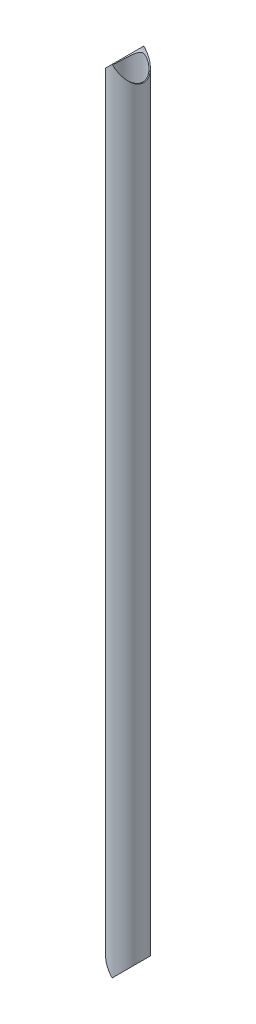
ISO-10303-21;
HEADER;
FILE_DESCRIPTION(('STEP AP214'),'2;1');
FILE_NAME('part.step','',(''),(''),'','','');
FILE_SCHEMA(('AUTOMOTIVE_DESIGN { 1 0 10303 214 1 1 1 1 }'));
ENDSEC;
DATA;
#1=APPLICATION_CONTEXT('core data for automotive mechanical design processes');
#2=APPLICATION_PROTOCOL_DEFINITION('international standard','automotive_design',2000,#1);
#3=PRODUCT_CONTEXT('',#1,'mechanical');
#4=PRODUCT('Part','Part','',(#3));
#5=PRODUCT_RELATED_PRODUCT_CATEGORY('part','',(#4));
#6=PRODUCT_DEFINITION_FORMATION('','',#4);
#7=PRODUCT_DEFINITION_CONTEXT('part definition',#1,'design');
#8=PRODUCT_DEFINITION('design','',#6,#7);
#9=PRODUCT_DEFINITION_SHAPE('','',#8);
#10=(LENGTH_UNIT() NAMED_UNIT(*) SI_UNIT(.MILLI.,.METRE.));
#11=(NAMED_UNIT(*) PLANE_ANGLE_UNIT() SI_UNIT($,.RADIAN.));
#12=(NAMED_UNIT(*) SI_UNIT($,.STERADIAN.) SOLID_ANGLE_UNIT());
#13=UNCERTAINTY_MEASURE_WITH_UNIT(LENGTH_MEASURE(1.E-05),#10,'distance_accuracy_value','');
#14=(GEOMETRIC_REPRESENTATION_CONTEXT(3) GLOBAL_UNCERTAINTY_ASSIGNED_CONTEXT((#13)) GLOBAL_UNIT_ASSIGNED_CONTEXT((#10,
#11,#12)) REPRESENTATION_CONTEXT('',''));
#15=CARTESIAN_POINT('',(0.,0.,0.));
#16=DIRECTION('',(0.,0.,1.));
#17=DIRECTION('',(1.,0.,0.));
#18=AXIS2_PLACEMENT_3D('',#15,#16,#17);
#19=CARTESIAN_POINT('',(0.,1586.5,0.));
#20=DIRECTION('',(0.,-1.,0.));
#21=DIRECTION('',(0.,0.,-1.));
#22=AXIS2_PLACEMENT_3D('',#19,#20,#21);
#23=CYLINDRICAL_SURFACE('',#22,29.75);
#24=CARTESIAN_POINT('',(0.,11.0905365064094,-29.75));
#25=CARTESIAN_POINT('',(-0.389786634074738,11.0905547654798,-29.7499958686815));
#26=CARTESIAN_POINT('',(-0.779656350245633,11.1112426258922,-29.7423062049833));
#27=CARTESIAN_POINT('',(-1.55465548150594,11.1923223687949,-29.7118861487787));
#28=CARTESIAN_POINT('',(-1.93978301720583,11.252729507378,-29.6891499769177));
#29=CARTESIAN_POINT('',(-2.70325860852338,11.4090848817424,-29.6294151445385));
#30=CARTESIAN_POINT('',(-3.08156917377103,11.5051890326873,-29.5923538865364));
#31=CARTESIAN_POINT('',(-3.8279231720212,11.7271393973298,-29.5050988141755));
#32=CARTESIAN_POINT('',(-4.19595982300085,11.8530047611088,-29.4548965418945));
#33=CARTESIAN_POINT('',(-4.83988887146421,12.0977982566289,-29.3550528177869));
#34=CARTESIAN_POINT('',(-5.11798813096088,12.2119874754248,-29.3077946821765));
#35=CARTESIAN_POINT('',(-5.66755818667232,12.4523189071293,-29.2064940913103));
#36=CARTESIAN_POINT('',(-5.93903125899485,12.578456940805,-29.1524540059855));
#37=CARTESIAN_POINT('',(-6.74454617771096,12.9718358118248,-28.9806059411968));
#38=CARTESIAN_POINT('',(-7.26931051096886,13.2538934019326,-28.8531291573911));
#39=CARTESIAN_POINT('',(-8.29858681774595,13.8451735068167,-28.5741341889987));
#40=CARTESIAN_POINT('',(-8.80302998445809,14.154478582079,-28.4225417313817));
#41=CARTESIAN_POINT('',(-9.79302702885514,14.7905267964488,-28.0968059614199));
#42=CARTESIAN_POINT('',(-10.2785852095513,15.1172659224224,-27.9226678257989));
#43=CARTESIAN_POINT('',(-11.2265971119138,15.7772779148017,-27.5550501032298));
#44=CARTESIAN_POINT('',(-11.6892796553624,16.1103943924101,-27.361876778719));
#45=CARTESIAN_POINT('',(-12.6004263626293,16.7832192509268,-26.9544207903546));
#46=CARTESIAN_POINT('',(-13.0488883889044,17.1229286105824,-26.7401349726928));
#47=CARTESIAN_POINT('',(-13.9329080362446,17.8058179800166,-26.2903530672039));
#48=CARTESIAN_POINT('',(-14.3684562690527,18.1490002827225,-26.0548420280147));
#49=CARTESIAN_POINT('',(-15.2269023152952,18.835932456591,-25.5626428997468));
#50=CARTESIAN_POINT('',(-15.6498008153182,19.179682295877,-25.3059559628832));
#51=CARTESIAN_POINT('',(-16.4826810283674,19.8651174770371,-24.7715201221602));
#52=CARTESIAN_POINT('',(-16.8926788095651,20.2068049209335,-24.4937990161967));
#53=CARTESIAN_POINT('',(-17.7002056270585,20.8865966619865,-23.916761261023));
#54=CARTESIAN_POINT('',(-18.0977342975374,21.2247008538259,-23.6174439790759));
#55=CARTESIAN_POINT('',(-19.2707521628523,22.2305924724449,-22.6869316302685));
#56=CARTESIAN_POINT('',(-20.0273597350873,22.8905292866021,-22.022737112695));
#57=CARTESIAN_POINT('',(-21.2900577165519,24.0042475019709,-20.7930817537449));
#58=CARTESIAN_POINT('',(-21.809261965208,24.466182051446,-20.248335408167));
#59=CARTESIAN_POINT('',(-22.8137653565131,25.3656809215908,-19.1094520378417));
#60=CARTESIAN_POINT('',(-23.2990645988789,25.803245313934,-18.5153151583663));
#61=CARTESIAN_POINT('',(-24.2307429949712,26.6475183564349,-17.2780835631524));
#62=CARTESIAN_POINT('',(-24.6771757154221,27.0542693705031,-16.6350585930376));
#63=CARTESIAN_POINT('',(-25.3140009187611,27.6367747690687,-15.6339463037159));
#64=CARTESIAN_POINT('',(-25.5207946409381,27.8263298380808,-15.2941665241954));
#65=CARTESIAN_POINT('',(-25.9228099519368,28.1954913881609,-14.6024143255455));
#66=CARTESIAN_POINT('',(-26.1180285871564,28.3750953292509,-14.2504388304407));
#67=CARTESIAN_POINT('',(-26.6066333794927,28.825325329928,-13.3252023772454));
#68=CARTESIAN_POINT('',(-26.8906577746177,29.0877516879405,-12.7429165382721));
#69=CARTESIAN_POINT('',(-27.4241206818578,29.581619868034,-11.5501862123445));
#70=CARTESIAN_POINT('',(-27.6735670097483,29.813068691643,-10.9397481304281));
#71=CARTESIAN_POINT('',(-28.1344709931178,30.2413824812595,-9.69306298340043));
#72=CARTESIAN_POINT('',(-28.3459397157476,30.4382575221294,-9.05682350360633));
#73=CARTESIAN_POINT('',(-28.7276010474503,30.7939975012523,-7.76164684157237));
#74=CARTESIAN_POINT('',(-28.8977932070091,30.9528620255589,-7.10270941223427));
#75=CARTESIAN_POINT('',(-29.1949202413367,31.2304424507515,-5.76145276387695));
#76=CARTESIAN_POINT('',(-29.3215253606574,31.348852244334,-5.07899650426861));
#77=CARTESIAN_POINT('',(-29.5271496337406,31.541262627531,-3.70072168051709));
#78=CARTESIAN_POINT('',(-29.6061686360677,31.6152630758198,-3.00490307385763));
#79=CARTESIAN_POINT('',(-29.714875374791,31.7170846032193,-1.60635896243673));
#80=CARTESIAN_POINT('',(-29.7445851463712,31.7449263096255,-0.903636684073787));
#81=CARTESIAN_POINT('',(-29.754061992673,31.7538060507705,0.50240277831833));
#82=CARTESIAN_POINT('',(-29.7338339182652,31.7348486314903,1.20571989793149));
#83=CARTESIAN_POINT('',(-29.6491936105601,31.6555603570597,2.52425771103579));
#84=CARTESIAN_POINT('',(-29.5902327749378,31.600334336552,3.14015023401767));
#85=CARTESIAN_POINT('',(-29.4347944452827,31.4548307044512,4.36292657918262));
#86=CARTESIAN_POINT('',(-29.3383205142681,31.3645564217661,4.96981125125557));
#87=CARTESIAN_POINT('',(-29.1094158958632,31.1505448857515,6.17075016149576));
#88=CARTESIAN_POINT('',(-28.9769831993067,31.0268057626033,6.76480368073016));
#89=CARTESIAN_POINT('',(-28.6781490808987,30.7479000501174,7.93675139888759));
#90=CARTESIAN_POINT('',(-28.5117457421729,30.5927316873139,8.51464468383784));
#91=CARTESIAN_POINT('',(-28.1414820301299,30.2479472417702,9.66947310039745));
#92=CARTESIAN_POINT('',(-27.9366054038179,30.0573986769878,10.2458025966687));
#93=CARTESIAN_POINT('',(-27.4957507203243,29.6480960908612,11.3760357739638));
#94=CARTESIAN_POINT('',(-27.2597729553585,29.4293423345238,11.929939665627));
#95=CARTESIAN_POINT('',(-26.7592899475234,28.9663694661109,13.0138139280605));
#96=CARTESIAN_POINT('',(-26.4947775679359,28.7221439838776,13.5437782641304));
#97=CARTESIAN_POINT('',(-25.9397414662152,28.2109640143708,14.5786543063511));
#98=CARTESIAN_POINT('',(-25.6492121759554,27.9440046622079,15.0835606134855));
#99=CARTESIAN_POINT('',(-25.1169458832339,27.4563740486659,15.9497485473505));
#100=CARTESIAN_POINT('',(-24.8801724124079,27.2399156082807,16.3164836268842));
#101=CARTESIAN_POINT('',(-24.3939747261632,26.7965681432332,17.0348045606707));
#102=CARTESIAN_POINT('',(-24.1445526149236,26.5696808540578,17.3863929167923));
#103=CARTESIAN_POINT('',(-23.378335909999,25.8747010870442,18.4187584242628));
#104=CARTESIAN_POINT('',(-22.8437126201265,25.3924024479632,19.0769394390896));
#105=CARTESIAN_POINT('',(-21.7319717372926,24.3970706889656,20.3344595415974));
#106=CARTESIAN_POINT('',(-21.1547571434914,23.8839679412324,20.9336565739085));
#107=CARTESIAN_POINT('',(-19.9634815327887,22.8355092811186,22.0726272482299));
#108=CARTESIAN_POINT('',(-19.3494260722199,22.3001567281731,22.6124098164828));
#109=CARTESIAN_POINT('',(-18.0715376358916,21.2007450044212,23.6468801031677));
#110=CARTESIAN_POINT('',(-17.4068395776148,20.6363023391548,24.1400861912206));
#111=CARTESIAN_POINT('',(-16.0430994913812,19.4996967548313,25.0671447457709));
#112=CARTESIAN_POINT('',(-15.3440487923045,18.9275319132924,25.5009821210423));
#113=CARTESIAN_POINT('',(-14.2701329668819,18.0718158982431,26.1073570105689));
#114=CARTESIAN_POINT('',(-13.9083101097899,17.7872808158147,26.3019136072273));
#115=CARTESIAN_POINT('',(-13.1755736313118,17.2203863233941,26.6765088069477));
#116=CARTESIAN_POINT('',(-12.8046607137291,16.9380267471732,26.8565485293857));
#117=CARTESIAN_POINT('',(-12.0533353587,16.3774346592547,27.2020310976645));
#118=CARTESIAN_POINT('',(-11.6729272217067,16.0992003670395,27.3674804030469));
#119=CARTESIAN_POINT('',(-10.9016562016147,15.5490510345134,27.6837519471826));
#120=CARTESIAN_POINT('',(-10.5107946953051,15.2771351707477,27.8345761001945));
#121=CARTESIAN_POINT('',(-9.76452327911668,14.774275769729,28.1043548087265));
#122=CARTESIAN_POINT('',(-9.41041065180429,14.5422993160262,28.2249673385792));
#123=CARTESIAN_POINT('',(-8.69217079499892,14.0881644429713,28.4543635058389));
#124=CARTESIAN_POINT('',(-8.3280438812505,13.8660057146464,28.5631475156575));
#125=CARTESIAN_POINT('',(-7.58836476067764,13.4347646770172,28.7685011265058));
#126=CARTESIAN_POINT('',(-7.21280502564051,13.2256912735528,28.8650624535425));
#127=CARTESIAN_POINT('',(-6.44925910410252,12.8252587357205,29.0451957375213));
#128=CARTESIAN_POINT('',(-6.06127417029368,12.6338978231232,29.1287689989617));
#129=CARTESIAN_POINT('',(-5.33457951483414,12.3032696499382,29.2697637112847));
#130=CARTESIAN_POINT('',(-4.99784486140739,12.1605574334073,29.3292304776445));
#131=CARTESIAN_POINT('',(-4.31448563428541,11.896032085652,29.4375160780683));
#132=CARTESIAN_POINT('',(-3.96786103136307,11.7742190161969,29.4863348806615));
#133=CARTESIAN_POINT('',(-3.26619686131055,11.556695924487,29.5722665920632));
#134=CARTESIAN_POINT('',(-2.91118716517001,11.460905066923,29.6094158087824));
#135=CARTESIAN_POINT('',(-2.1932022298095,11.2999119454814,29.6712320370334));
#136=CARTESIAN_POINT('',(-1.83022967294849,11.2346995417067,29.6959031865393));
#137=CARTESIAN_POINT('',(-1.16008167263112,11.1469521735966,29.7289379767563));
#138=CARTESIAN_POINT('',(-0.853700529628577,11.1191121508306,29.7393356185741));
#139=CARTESIAN_POINT('',(-0.239516864989627,11.088884706075,29.7506204726806));
#140=CARTESIAN_POINT('',(0.0682854773377016,11.0864941564844,29.7515088536055));
#141=CARTESIAN_POINT('',(0.682953502646771,11.107296867007,29.7437484363848));
#142=CARTESIAN_POINT('',(0.98981898252222,11.1304953274846,29.7350976996379));
#143=CARTESIAN_POINT('',(1.60030828822649,11.2012927636462,29.7084994386996));
#144=CARTESIAN_POINT('',(1.9039315627099,11.2488958240068,29.690550358209));
#145=CARTESIAN_POINT('',(2.60238864895339,11.3851065409088,29.6386359462027));
#146=CARTESIAN_POINT('',(2.99537257351855,11.4819555981987,29.6013857702236));
#147=CARTESIAN_POINT('',(3.77024678737348,11.7079906074488,29.5127106441841));
#148=CARTESIAN_POINT('',(4.15213175946479,11.8371917824298,29.461279020005));
#149=CARTESIAN_POINT('',(4.90556490974097,12.1219790395361,29.3452523664533));
#150=CARTESIAN_POINT('',(5.27706415639093,12.2776713745226,29.2806041076083));
#151=CARTESIAN_POINT('',(6.0084154258991,12.6093141684073,29.139323576331));
#152=CARTESIAN_POINT('',(6.36826813790345,12.7852634258494,29.0626920145426));
#153=CARTESIAN_POINT('',(7.09084807735665,13.1598261406559,28.8950718060913));
#154=CARTESIAN_POINT('',(7.45315388175316,13.3590508909607,28.8036444419389));
#155=CARTESIAN_POINT('',(8.16735292475269,13.7702733347846,28.6093311570663));
#156=CARTESIAN_POINT('',(8.51924358851232,13.9822741481309,28.5064424323133));
#157=CARTESIAN_POINT('',(9.21389187645439,14.4160373041844,28.2895601267898));
#158=CARTESIAN_POINT('',(9.55664105320202,14.6378082054652,28.1755566991079));
#159=CARTESIAN_POINT('',(10.2335356973178,15.0884612508925,27.9368207607673));
#160=CARTESIAN_POINT('',(10.5676818559023,15.3173428204455,27.8120891155933));
#161=CARTESIAN_POINT('',(11.5593758030251,16.0123505660182,27.4216916912023));
#162=CARTESIAN_POINT('',(12.2052763829725,16.48626251353,27.1401076091863));
#163=CARTESIAN_POINT('',(13.4696359069485,17.4430923315165,26.535295317365));
#164=CARTESIAN_POINT('',(14.0881060514466,17.9260064096568,26.2120843192006));
#165=CARTESIAN_POINT('',(15.4023246849334,18.9749641153719,25.4655545673132));
#166=CARTESIAN_POINT('',(16.0935049269008,19.5412859049791,25.0345463676907));
#167=CARTESIAN_POINT('',(17.4425260533232,20.6664916285502,24.1140510284234));
#168=CARTESIAN_POINT('',(18.1003593839133,21.2253738563217,23.6245507224938));
#169=CARTESIAN_POINT('',(19.3802170324256,22.3268202087747,22.5864478916291));
#170=CARTESIAN_POINT('',(20.0022881260064,22.8694051843395,22.0379253943263));
#171=CARTESIAN_POINT('',(21.2082702813319,23.9313439996297,20.8799016227878));
#172=CARTESIAN_POINT('',(21.7921900114544,24.450703107987,20.2704142805967));
#173=CARTESIAN_POINT('',(22.8216818109853,25.3729428784289,19.0980170993068));
#174=CARTESIAN_POINT('',(23.2739196774229,25.7806373518994,18.5447444851815));
#175=CARTESIAN_POINT('',(24.1453052424604,26.5699394549014,17.3950260761189));
#176=CARTESIAN_POINT('',(24.5644531531964,26.9515472516697,16.7985805580053));
#177=CARTESIAN_POINT('',(25.3650913312465,27.6832348232156,15.5632887932803));
#178=CARTESIAN_POINT('',(25.7466095813529,28.0333380087319,14.9244746538717));
#179=CARTESIAN_POINT('',(26.4674265851008,28.696773685047,13.6052366543115));
#180=CARTESIAN_POINT('',(26.8067335513667,29.0101133278812,12.9248209267048));
#181=CARTESIAN_POINT('',(27.3809760459167,29.5416364276304,11.650800977672));
#182=CARTESIAN_POINT('',(27.6237053406399,29.7667962435169,11.0636121211692));
#183=CARTESIAN_POINT('',(28.0741160057463,30.1852454459442,9.86490185607038));
#184=CARTESIAN_POINT('',(28.2818009140399,30.3785380495981,9.25338291143359));
#185=CARTESIAN_POINT('',(28.6590002997172,30.7300116219047,8.00915332537501));
#186=CARTESIAN_POINT('',(28.8285341309196,30.8882103928715,7.3764536168208));
#187=CARTESIAN_POINT('',(29.1267645869337,31.1667382371586,6.09326614731948));
#188=CARTESIAN_POINT('',(29.255460860277,31.2870669845503,5.44277823333051));
#189=CARTESIAN_POINT('',(29.4702710526886,31.488020340269,4.12479330456963));
#190=CARTESIAN_POINT('',(29.556136515439,31.5684132749748,3.45722013433693));
#191=CARTESIAN_POINT('',(29.6824593084492,31.6867148585293,2.11402432396593));
#192=CARTESIAN_POINT('',(29.7229164971542,31.724623374938,1.43840165874097));
#193=CARTESIAN_POINT('',(29.7575771604925,31.7570993943658,0.0850399325325687));
#194=CARTESIAN_POINT('',(29.751788364036,31.7516741395883,-0.592698755883226));
#195=CARTESIAN_POINT('',(29.694093871972,31.6976199054799,-1.94444238904165));
#196=CARTESIAN_POINT('',(29.6421909168635,31.6489934935325,-2.61844755326725));
#197=CARTESIAN_POINT('',(29.5001714251217,31.5160206821034,-3.8957473276297));
#198=CARTESIAN_POINT('',(29.413984080033,31.4353480011763,-4.49987110394024));
#199=CARTESIAN_POINT('',(29.2058576089332,31.240690798668,-5.69641058916888));
#200=CARTESIAN_POINT('',(29.0839211511809,31.1267087632478,-6.28882716837297));
#201=CARTESIAN_POINT('',(28.8061224980544,30.8673002518418,-7.45863973697959));
#202=CARTESIAN_POINT('',(28.6502571164765,30.7218708226968,-8.03603430998793));
#203=CARTESIAN_POINT('',(28.3067457741336,30.4017758149275,-9.17296977878713));
#204=CARTESIAN_POINT('',(28.1190978348605,30.2271084162071,-9.73250956051398));
#205=CARTESIAN_POINT('',(27.7011193041874,29.8386606808561,-10.8673646914903));
#206=CARTESIAN_POINT('',(27.468802769476,29.6230720410663,-11.4413276774205));
#207=CARTESIAN_POINT('',(26.9735662833493,29.1644397967712,-12.5644727032899));
#208=CARTESIAN_POINT('',(26.7106458940065,28.9213957993935,-13.1136543884637));
#209=CARTESIAN_POINT('',(26.1569050403771,28.410776161889,-14.1860170057295));
#210=CARTESIAN_POINT('',(25.8660789038327,28.14319553482,-14.7091926187542));
#211=CARTESIAN_POINT('',(25.2590823664093,27.5863488281552,-15.7287423492722));
#212=CARTESIAN_POINT('',(24.9429065031294,27.29707807561,-16.2251106515094));
#213=CARTESIAN_POINT('',(24.3604699810326,26.7660520392294,-17.0832046348944));
#214=CARTESIAN_POINT('',(24.0987329596559,26.5280247792571,-17.450336718156));
#215=CARTESIAN_POINT('',(23.5624314766098,26.0418011231732,-18.1679648216939));
#216=CARTESIAN_POINT('',(23.2878690335152,25.7936063280666,-18.5184634424982));
#217=CARTESIAN_POINT('',(22.4459519777231,25.0351972276786,-19.5454803058947));
#218=CARTESIAN_POINT('',(21.8605199232213,24.5112974432471,-20.1972967970451));
#219=CARTESIAN_POINT('',(20.6459796315424,23.4345313989071,-21.437394320565));
#220=CARTESIAN_POINT('',(20.0167468855994,22.8815837590722,-22.02548097924));
#221=CARTESIAN_POINT('',(18.7202628380163,21.7564708873476,-23.1374914398223));
#222=CARTESIAN_POINT('',(18.0530199942944,21.1843099423004,-23.6614294348553));
#223=CARTESIAN_POINT('',(17.0163042212589,20.3105659459539,-24.406870362439));
#224=CARTESIAN_POINT('',(16.6599560403023,20.0128202323422,-24.6514626137153));
#225=CARTESIAN_POINT('',(15.937856067266,19.415815988226,-25.1243612950648));
#226=CARTESIAN_POINT('',(15.5721048960382,19.1165575586446,-25.3526687966342));
#227=CARTESIAN_POINT('',(14.8308884146061,18.5177619141533,-25.7932792137087));
#228=CARTESIAN_POINT('',(14.4554175157191,18.2182246388099,-26.0055726339275));
#229=CARTESIAN_POINT('',(13.6946626224083,17.6206789686737,-26.4141086720424));
#230=CARTESIAN_POINT('',(13.3093788369933,17.3226705414794,-26.6103516314298));
#231=CARTESIAN_POINT('',(12.5294056252708,16.7308576499025,-26.986357395926));
#232=CARTESIAN_POINT('',(12.1347417154507,16.4370446358135,-27.1661596191787));
#233=CARTESIAN_POINT('',(11.3342210015448,15.8552487328021,-27.5097746572304));
#234=CARTESIAN_POINT('',(10.928363120245,15.5672664096333,-27.6735859262603));
#235=CARTESIAN_POINT('',(10.1047499434566,15.0005572806551,-27.9848200427194));
#236=CARTESIAN_POINT('',(9.68700760608899,14.7218210615849,-28.1322599405147));
#237=CARTESIAN_POINT('',(8.83776321866947,14.1774373075774,-28.4104926097053));
#238=CARTESIAN_POINT('',(8.40626509008957,13.9117860963944,-28.5412900733481));
#239=CARTESIAN_POINT('',(7.61339209532025,13.4492169914477,-28.7616640803161));
#240=CARTESIAN_POINT('',(7.25479308539916,13.2490124913681,-28.8543009069735));
#241=CARTESIAN_POINT('',(6.52624565746093,12.8645286107868,-29.0277599685487));
#242=CARTESIAN_POINT('',(6.15629633864085,12.6802504987158,-29.1085812627919));
#243=CARTESIAN_POINT('',(5.40494617216877,12.332992550598,-29.2573991735927));
#244=CARTESIAN_POINT('',(5.02357230659325,12.1699667531348,-29.3254236115103));
#245=CARTESIAN_POINT('',(4.24819480971089,11.8709497301069,-29.4477363741699));
#246=CARTESIAN_POINT('',(3.85419660980487,11.7349470549582,-29.5020305190506));
#247=CARTESIAN_POINT('',(3.17496909521549,11.5329681054773,-29.5814323489919));
#248=CARTESIAN_POINT('',(2.89279221559383,11.4582447036743,-29.6104034361112));
#249=CARTESIAN_POINT('',(2.32340302288666,11.3279066337919,-29.6605110773758));
#250=CARTESIAN_POINT('',(2.036192264054,11.2722861730697,-29.6816500066435));
#251=CARTESIAN_POINT('',(1.45846908996883,11.1823939055431,-29.7156339587148));
#252=CARTESIAN_POINT('',(1.16796383014347,11.1480824824987,-29.7284943739757));
#253=CARTESIAN_POINT('',(0.584987626488327,11.1021498536814,-29.7456778453571));
#254=CARTESIAN_POINT('',(0.29251720842487,11.0905228038043,-29.7500031003674));
#255=CARTESIAN_POINT('',(0.,11.0905365064094,-29.75));
#256=B_SPLINE_CURVE_WITH_KNOTS('',3,(#24,#25,#26,#27,#28,#29,#30,#31,#32,#33,#34,#35,#36,#37,
#38,#39,#40,#41,#42,#43,#44,#45,#46,#47,#48,#49,#50,#51,#52,#53,#54,#55,#56,#57,#58,#59,#60,#61,
#62,#63,#64,#65,#66,#67,#68,#69,#70,#71,#72,#73,#74,#75,#76,#77,#78,#79,#80,#81,#82,#83,#84,#85,
#86,#87,#88,#89,#90,#91,#92,#93,#94,#95,#96,#97,#98,#99,#100,#101,#102,#103,#104,#105,#106,#107,
#108,#109,#110,#111,#112,#113,#114,#115,#116,#117,#118,#119,#120,#121,#122,#123,#124,#125,#126,
#127,#128,#129,#130,#131,#132,#133,#134,#135,#136,#137,#138,#139,#140,#141,#142,#143,#144,#145,
#146,#147,#148,#149,#150,#151,#152,#153,#154,#155,#156,#157,#158,#159,#160,#161,#162,#163,#164,
#165,#166,#167,#168,#169,#170,#171,#172,#173,#174,#175,#176,#177,#178,#179,#180,#181,#182,#183,
#184,#185,#186,#187,#188,#189,#190,#191,#192,#193,#194,#195,#196,#197,#198,#199,#200,#201,#202,
#203,#204,#205,#206,#207,#208,#209,#210,#211,#212,#213,#214,#215,#216,#217,#218,#219,#220,#221,
#222,#223,#224,#225,#226,#227,#228,#229,#230,#231,#232,#233,#234,#235,#236,#237,#238,#239,#240,
#241,#242,#243,#244,#245,#246,#247,#248,#249,#250,#251,#252,#253,#254,#255),.UNSPECIFIED.,.T.,
.F.,(4,2,2,2,2,2,2,2,2,2,2,2,2,2,2,2,2,2,2,2,2,2,2,2,2,2,2,2,2,2,2,2,2,2,2,2,2,2,2,2,2,2,2,2,2,
2,2,2,2,2,2,2,2,2,2,2,2,2,2,2,2,2,2,2,2,2,2,2,2,2,2,2,2,2,2,2,2,2,2,2,2,2,2,2,2,2,2,2,2,2,2,2,2,
2,2,2,2,2,2,2,2,2,2,2,2,2,2,2,2,2,2,2,2,2,2,4),(0.,1.16891134014491,2.33827191920253,
3.51280119401441,4.68808829530305,5.60064807304648,6.51288984298422,8.33858612171655,
10.1700182213135,12.0010305482334,13.8063065943685,15.6118527247459,17.4186808008102,
19.2254106291866,21.0297930775792,22.834228413258,26.4401243873686,29.0871083216066,
31.734084470558,34.3773527537654,35.6988383726708,37.0206597551485,39.1155544269692,
41.2099748091917,43.303783857147,45.3976157062891,47.5069570882846,49.6163051828904,
51.7247104033156,53.8329108251905,55.6942385205039,57.5553894688669,59.4166444288996,
61.2780044437132,63.1980987810791,65.1181750791752,67.0387327208592,68.9597023862355,
70.4209304980427,71.8819163179431,74.8046555024108,77.7342698265168,80.6634434120745,
83.6665316756636,86.6703818966988,88.1693285710861,89.6681595530299,91.1663235983926,
92.6642912864671,93.9844954254648,95.3046579868151,96.6257094901071,97.9466282234547,
99.0574998489687,100.168374757707,101.275758328833,102.38277442846,103.305097026732,
104.22730627529,105.149702975727,106.072254111104,107.289539819541,108.507399391577,
109.73026404769,110.953056211943,112.222861826623,113.492978785571,114.764231392197,
116.035381538236,118.581000408742,121.12557009138,124.099479068732,127.074058723825,
130.044654819719,133.0145736018,135.480694443605,137.946799474091,140.411056568776,
142.874833465448,144.895193369751,146.915349186173,148.934477867464,150.953623925914,
152.984350413331,155.015083231269,157.045476667892,159.075749449183,160.92033294105,
162.764778791075,164.609397924442,166.45413193013,168.419216894706,170.384329982231,
172.349843357777,174.315781409581,175.844794825035,177.373568396802,180.432023192217,
183.499558139745,186.566413152771,188.14067381321,189.714830795465,191.289913928923,
192.864963542021,194.436131979781,196.007452144813,197.577120158842,199.146344627858,
200.408897357302,201.671550548175,202.931426079819,204.190766663816,205.070113883378,
205.949194219903,206.826635301926,207.703850301684),.UNSPECIFIED.);
#257=CARTESIAN_POINT('',(0.,11.0905365064094,-29.75));
#258=VERTEX_POINT('',#257);
#259=EDGE_CURVE('E37',#258,#258,#256,.T.);
#260=ORIENTED_EDGE('',*,*,#259,.F.);
#261=EDGE_LOOP('',(#260));
#262=FACE_BOUND('',#261,.T.);
#263=CARTESIAN_POINT('',(0.,1575.40946349359,-29.75));
#264=CARTESIAN_POINT('',(0.389786634074738,1575.40944523452,-29.7499958686815));
#265=CARTESIAN_POINT('',(0.779656350245632,1575.38875737411,-29.7423062049833));
#266=CARTESIAN_POINT('',(1.55465548150594,1575.30767763121,-29.7118861487787));
#267=CARTESIAN_POINT('',(1.93978301720583,1575.24727049262,-29.6891499769177));
#268=CARTESIAN_POINT('',(2.70325860852335,1575.09091511826,-29.6294151445385));
#269=CARTESIAN_POINT('',(3.08156917377098,1574.99481096731,-29.5923538865364));
#270=CARTESIAN_POINT('',(3.82792317202115,1574.77286060267,-29.5050988141755));
#271=CARTESIAN_POINT('',(4.19595982300082,1574.64699523889,-29.4548965418945));
#272=CARTESIAN_POINT('',(4.83988887146418,1574.40220174337,-29.3550528177869));
#273=CARTESIAN_POINT('',(5.11798813096081,1574.28801252458,-29.3077946821766));
#274=CARTESIAN_POINT('',(5.66755818667227,1574.04768109287,-29.2064940913104));
#275=CARTESIAN_POINT('',(5.93903125899484,1573.9215430592,-29.1524540059855));
#276=CARTESIAN_POINT('',(6.74454617771097,1573.52816418818,-28.9806059411968));
#277=CARTESIAN_POINT('',(7.26931051096886,1573.24610659807,-28.8531291573911));
#278=CARTESIAN_POINT('',(8.29858681774595,1572.65482649318,-28.5741341889987));
#279=CARTESIAN_POINT('',(8.8030299844581,1572.34552141792,-28.4225417313817));
#280=CARTESIAN_POINT('',(9.79302702885515,1571.70947320355,-28.0968059614199));
#281=CARTESIAN_POINT('',(10.2785852095513,1571.38273407758,-27.9226678257989));
#282=CARTESIAN_POINT('',(11.2265971119138,1570.7227220852,-27.5550501032298));
#283=CARTESIAN_POINT('',(11.6892796553624,1570.38960560759,-27.361876778719));
#284=CARTESIAN_POINT('',(12.6004263626295,1569.71678074907,-26.9544207903546));
#285=CARTESIAN_POINT('',(13.0488883889046,1569.37707138942,-26.7401349726927));
#286=CARTESIAN_POINT('',(13.9329080362449,1568.69418201998,-26.2903530672038));
#287=CARTESIAN_POINT('',(14.368456269053,1568.35099971728,-26.0548420280145));
#288=CARTESIAN_POINT('',(15.2269023152955,1567.66406754341,-25.5626428997466));
#289=CARTESIAN_POINT('',(15.6498008153185,1567.32031770412,-25.305955962883));
#290=CARTESIAN_POINT('',(16.4826810283676,1566.63488252296,-24.77152012216));
#291=CARTESIAN_POINT('',(16.8926788095653,1566.29319507907,-24.4937990161966));
#292=CARTESIAN_POINT('',(17.7002056270588,1565.61340333801,-23.9167612610228));
#293=CARTESIAN_POINT('',(18.0977342975376,1565.27529914617,-23.6174439790758));
#294=CARTESIAN_POINT('',(19.2707521628524,1564.26940752755,-22.6869316302684));
#295=CARTESIAN_POINT('',(20.0273597350874,1563.6094707134,-22.0227371126948));
#296=CARTESIAN_POINT('',(21.290057716552,1562.49575249803,-20.7930817537448));
#297=CARTESIAN_POINT('',(21.8092619652081,1562.03381794855,-20.2483354081669));
#298=CARTESIAN_POINT('',(22.8137653565132,1561.13431907841,-19.1094520378416));
#299=CARTESIAN_POINT('',(23.299064598879,1560.69675468607,-18.5153151583662));
#300=CARTESIAN_POINT('',(24.2307429949713,1559.85248164357,-17.2780835631522));
#301=CARTESIAN_POINT('',(24.6771757154222,1559.4457306295,-16.6350585930375));
#302=CARTESIAN_POINT('',(25.3140009187611,1558.86322523093,-15.6339463037159));
#303=CARTESIAN_POINT('',(25.5207946409381,1558.67367016192,-15.2941665241954));
#304=CARTESIAN_POINT('',(25.9228099519368,1558.30450861184,-14.6024143255455));
#305=CARTESIAN_POINT('',(26.1180285871564,1558.12490467075,-14.2504388304406));
#306=CARTESIAN_POINT('',(26.6066333794927,1557.67467467007,-13.3252023772453));
#307=CARTESIAN_POINT('',(26.8906577746177,1557.41224831206,-12.7429165382721));
#308=CARTESIAN_POINT('',(27.4241206818578,1556.91838013197,-11.5501862123445));
#309=CARTESIAN_POINT('',(27.6735670097483,1556.68693130836,-10.939748130428));
#310=CARTESIAN_POINT('',(28.1344709931178,1556.25861751874,-9.69306298340044));
#311=CARTESIAN_POINT('',(28.3459397157476,1556.06174247787,-9.05682350360636));
#312=CARTESIAN_POINT('',(28.7276010474503,1555.70600249875,-7.76164684157244));
#313=CARTESIAN_POINT('',(28.8977932070091,1555.54713797444,-7.10270941223432));
#314=CARTESIAN_POINT('',(29.1949202413366,1555.26955754925,-5.761452763877));
#315=CARTESIAN_POINT('',(29.3215253606574,1555.15114775567,-5.07899650426866));
#316=CARTESIAN_POINT('',(29.5271496337406,1554.95873737247,-3.70072168051715));
#317=CARTESIAN_POINT('',(29.6061686360677,1554.88473692418,-3.00490307385769));
#318=CARTESIAN_POINT('',(29.714875374791,1554.78291539678,-1.60635896243679));
#319=CARTESIAN_POINT('',(29.7445851463712,1554.75507369037,-0.903636684073842));
#320=CARTESIAN_POINT('',(29.754061992673,1554.74619394923,0.502402778318275));
#321=CARTESIAN_POINT('',(29.7338339182652,1554.76515136851,1.20571989793144));
#322=CARTESIAN_POINT('',(29.6491936105601,1554.84443964294,2.52425771103573));
#323=CARTESIAN_POINT('',(29.5902327749378,1554.89966566345,3.14015023401762));
#324=CARTESIAN_POINT('',(29.4347944452827,1555.04516929555,4.36292657918256));
#325=CARTESIAN_POINT('',(29.3383205142681,1555.13544357823,4.96981125125552));
#326=CARTESIAN_POINT('',(29.1094158958632,1555.34945511425,6.17075016149569));
#327=CARTESIAN_POINT('',(28.9769831993067,1555.4731942374,6.76480368073008));
#328=CARTESIAN_POINT('',(28.6781490808988,1555.75209994988,7.93675139888749));
#329=CARTESIAN_POINT('',(28.511745742173,1555.90726831269,8.51464468383774));
#330=CARTESIAN_POINT('',(28.14148203013,1556.25205275823,9.66947310039737));
#331=CARTESIAN_POINT('',(27.9366054038179,1556.44260132301,10.2458025966687));
#332=CARTESIAN_POINT('',(27.4957507203244,1556.85190390914,11.3760357739637));
#333=CARTESIAN_POINT('',(27.2597729553586,1557.07065766548,11.9299396656269));
#334=CARTESIAN_POINT('',(26.7592899475235,1557.53363053389,13.0138139280604));
#335=CARTESIAN_POINT('',(26.494777567936,1557.77785601612,13.5437782641302));
#336=CARTESIAN_POINT('',(25.9397414662153,1558.28903598563,14.5786543063509));
#337=CARTESIAN_POINT('',(25.6492121759555,1558.55599533779,15.0835606134853));
#338=CARTESIAN_POINT('',(25.116945883234,1559.04362595133,15.9497485473504));
#339=CARTESIAN_POINT('',(24.8801724124079,1559.26008439172,16.3164836268842));
#340=CARTESIAN_POINT('',(24.3939747261632,1559.70343185677,17.0348045606707));
#341=CARTESIAN_POINT('',(24.1445526149236,1559.93031914594,17.3863929167922));
#342=CARTESIAN_POINT('',(23.3783359099991,1560.62529891296,18.4187584242626));
#343=CARTESIAN_POINT('',(22.8437126201266,1561.10759755204,19.0769394390894));
#344=CARTESIAN_POINT('',(21.7319717372927,1562.10292931103,20.3344595415973));
#345=CARTESIAN_POINT('',(21.1547571434915,1562.61603205877,20.9336565739084));
#346=CARTESIAN_POINT('',(19.9634815327888,1563.66449071888,22.0726272482298));
#347=CARTESIAN_POINT('',(19.34942607222,1564.19984327183,22.6124098164827));
#348=CARTESIAN_POINT('',(18.0715376358918,1565.29925499558,23.6468801031676));
#349=CARTESIAN_POINT('',(17.4068395776149,1565.86369766084,24.1400861912205));
#350=CARTESIAN_POINT('',(16.0430994913814,1567.00030324517,25.0671447457708));
#351=CARTESIAN_POINT('',(15.3440487923046,1567.57246808671,25.5009821210421));
#352=CARTESIAN_POINT('',(14.2701329668821,1568.42818410176,26.1073570105688));
#353=CARTESIAN_POINT('',(13.9083101097901,1568.71271918419,26.3019136072272));
#354=CARTESIAN_POINT('',(13.175573631312,1569.27961367661,26.6765088069476));
#355=CARTESIAN_POINT('',(12.8046607137293,1569.56197325283,26.8565485293856));
#356=CARTESIAN_POINT('',(12.0533353587002,1570.12256534075,27.2020310976644));
#357=CARTESIAN_POINT('',(11.6729272217069,1570.40079963296,27.3674804030468));
#358=CARTESIAN_POINT('',(10.901656201615,1570.95094896549,27.6837519471826));
#359=CARTESIAN_POINT('',(10.5107946953052,1571.22286482925,27.8345761001944));
#360=CARTESIAN_POINT('',(9.76452327911684,1571.72572423027,28.1043548087264));
#361=CARTESIAN_POINT('',(9.41041065180444,1571.95770068397,28.2249673385792));
#362=CARTESIAN_POINT('',(8.69217079499905,1572.41183555703,28.4543635058388));
#363=CARTESIAN_POINT('',(8.32804388125063,1572.63399428535,28.5631475156575));
#364=CARTESIAN_POINT('',(7.58836476067775,1573.06523532298,28.7685011265058));
#365=CARTESIAN_POINT('',(7.21280502564062,1573.27430872645,28.8650624535425));
#366=CARTESIAN_POINT('',(6.44925910410265,1573.67474126428,29.0451957375212));
#367=CARTESIAN_POINT('',(6.06127417029382,1573.86610217688,29.1287689989617));
#368=CARTESIAN_POINT('',(5.33457951483436,1574.19673035006,29.2697637112847));
#369=CARTESIAN_POINT('',(4.99784486140766,1574.33944256659,29.3292304776444));
#370=CARTESIAN_POINT('',(4.31448563428567,1574.60396791435,29.4375160780683));
#371=CARTESIAN_POINT('',(3.96786103136329,1574.7257809838,29.4863348806615));
#372=CARTESIAN_POINT('',(3.26619686131077,1574.94330407551,29.5722665920632));
#373=CARTESIAN_POINT('',(2.91118716517026,1575.03909493308,29.6094158087824));
#374=CARTESIAN_POINT('',(2.19320222980977,1575.20008805452,29.6712320370333));
#375=CARTESIAN_POINT('',(1.83022967294875,1575.26530045829,29.6959031865393));
#376=CARTESIAN_POINT('',(1.16008167263137,1575.3530478264,29.7289379767563));
#377=CARTESIAN_POINT('',(0.853700529628834,1575.38088784917,29.7393356185741));
#378=CARTESIAN_POINT('',(0.239516864989898,1575.41111529392,29.7506204726805));
#379=CARTESIAN_POINT('',(-0.0682854773374211,1575.41350584352,29.7515088536055));
#380=CARTESIAN_POINT('',(-0.682953502646486,1575.39270313299,29.7437484363848));
#381=CARTESIAN_POINT('',(-0.989818982521939,1575.36950467252,29.7350976996379));
#382=CARTESIAN_POINT('',(-1.60030828822621,1575.29870723635,29.7084994386996));
#383=CARTESIAN_POINT('',(-1.90393156270961,1575.25110417599,29.6905503582091));
#384=CARTESIAN_POINT('',(-2.60238864895307,1575.11489345909,29.6386359462027));
#385=CARTESIAN_POINT('',(-2.99537257351822,1575.0180444018,29.6013857702236));
#386=CARTESIAN_POINT('',(-3.77024678737313,1574.79200939255,29.5127106441841));
#387=CARTESIAN_POINT('',(-4.15213175946442,1574.66280821757,29.4612790200051));
#388=CARTESIAN_POINT('',(-4.90556490974056,1574.37802096046,29.3452523664534));
#389=CARTESIAN_POINT('',(-5.27706415639048,1574.22232862548,29.2806041076084));
#390=CARTESIAN_POINT('',(-6.00841542589862,1573.89068583159,29.1393235763311));
#391=CARTESIAN_POINT('',(-6.36826813790297,1573.71473657415,29.0626920145427));
#392=CARTESIAN_POINT('',(-7.09084807735615,1573.34017385934,28.8950718060914));
#393=CARTESIAN_POINT('',(-7.45315388175265,1573.14094910904,28.8036444419391));
#394=CARTESIAN_POINT('',(-8.16735292475211,1572.72972666522,28.6093311570664));
#395=CARTESIAN_POINT('',(-8.51924358851168,1572.51772585187,28.5064424323135));
#396=CARTESIAN_POINT('',(-9.21389187645369,1572.08396269582,28.2895601267901));
#397=CARTESIAN_POINT('',(-9.55664105320131,1571.86219179454,28.1755566991082));
#398=CARTESIAN_POINT('',(-10.2335356973171,1571.41153874911,27.9368207607676));
#399=CARTESIAN_POINT('',(-10.5676818559016,1571.18265717956,27.8120891155936));
#400=CARTESIAN_POINT('',(-11.5593758030242,1570.48764943398,27.4216916912026));
#401=CARTESIAN_POINT('',(-12.2052763829717,1570.01373748647,27.1401076091867));
#402=CARTESIAN_POINT('',(-13.4696359069477,1569.05690766848,26.5352953173654));
#403=CARTESIAN_POINT('',(-14.0881060514457,1568.57399359034,26.2120843192011));
#404=CARTESIAN_POINT('',(-15.4023246849324,1567.52503588463,25.4655545673138));
#405=CARTESIAN_POINT('',(-16.0935049268998,1566.95871409502,25.0345463676913));
#406=CARTESIAN_POINT('',(-17.4425260533222,1565.83350837145,24.1140510284241));
#407=CARTESIAN_POINT('',(-18.1003593839123,1565.27462614368,23.6245507224946));
#408=CARTESIAN_POINT('',(-19.3802170324246,1564.17317979123,22.58644789163));
#409=CARTESIAN_POINT('',(-20.0022881260053,1563.63059481566,22.0379253943272));
#410=CARTESIAN_POINT('',(-21.2082702813308,1562.56865600037,20.8799016227889));
#411=CARTESIAN_POINT('',(-21.7921900114533,1562.04929689201,20.2704142805979));
#412=CARTESIAN_POINT('',(-22.8216818109841,1561.12705712157,19.0980170993081));
#413=CARTESIAN_POINT('',(-23.2739196774219,1560.7193626481,18.5447444851829));
#414=CARTESIAN_POINT('',(-24.1453052424595,1559.9300605451,17.3950260761202));
#415=CARTESIAN_POINT('',(-24.5644531531955,1559.54845274833,16.7985805580066));
#416=CARTESIAN_POINT('',(-25.3650913312458,1558.81676517679,15.5632887932815));
#417=CARTESIAN_POINT('',(-25.7466095813522,1558.46666199127,14.9244746538729));
#418=CARTESIAN_POINT('',(-26.4674265851001,1557.80322631495,13.6052366543128));
#419=CARTESIAN_POINT('',(-26.8067335513661,1557.48988667212,12.9248209267061));
#420=CARTESIAN_POINT('',(-27.3809760459162,1556.95836357237,11.6508009776733));
#421=CARTESIAN_POINT('',(-27.6237053406394,1556.73320375648,11.0636121211705));
#422=CARTESIAN_POINT('',(-28.0741160057458,1556.31475455406,9.86490185607163));
#423=CARTESIAN_POINT('',(-28.2818009140395,1556.1214619504,9.25338291143485));
#424=CARTESIAN_POINT('',(-28.6590002997169,1555.7699883781,8.00915332537626));
#425=CARTESIAN_POINT('',(-28.8285341309193,1555.61178960713,7.37645361682203));
#426=CARTESIAN_POINT('',(-29.1267645869334,1555.33326176284,6.09326614732068));
#427=CARTESIAN_POINT('',(-29.2554608602768,1555.21293301545,5.44277823333171));
#428=CARTESIAN_POINT('',(-29.4702710526884,1555.01197965973,4.12479330457082));
#429=CARTESIAN_POINT('',(-29.5561365154389,1554.93158672503,3.45722013433811));
#430=CARTESIAN_POINT('',(-29.6824593084491,1554.81328514147,2.11402432396709));
#431=CARTESIAN_POINT('',(-29.7229164971541,1554.77537662506,1.43840165874211));
#432=CARTESIAN_POINT('',(-29.7575771604925,1554.74290060563,0.0850399325336677));
#433=CARTESIAN_POINT('',(-29.751788364036,1554.74832586041,-0.592698755882148));
#434=CARTESIAN_POINT('',(-29.6940938719721,1554.80238009452,-1.94444238904061));
#435=CARTESIAN_POINT('',(-29.6421909168636,1554.85100650647,-2.61844755326622));
#436=CARTESIAN_POINT('',(-29.5001714251219,1554.9839793179,-3.89574732762871));
#437=CARTESIAN_POINT('',(-29.4139840800331,1555.06465199882,-4.49987110393926));
#438=CARTESIAN_POINT('',(-29.2058576089334,1555.25930920133,-5.69641058916792));
#439=CARTESIAN_POINT('',(-29.0839211511812,1555.37329123675,-6.288827168372));
#440=CARTESIAN_POINT('',(-28.8061224980547,1555.63269974816,-7.45863973697864));
#441=CARTESIAN_POINT('',(-28.6502571164768,1555.7781291773,-8.036034309987));
#442=CARTESIAN_POINT('',(-28.3067457741339,1556.09822418507,-9.17296977878623));
#443=CARTESIAN_POINT('',(-28.1190978348608,1556.27289158379,-9.73250956051307));
#444=CARTESIAN_POINT('',(-27.7011193041878,1556.66133931914,-10.8673646914894));
#445=CARTESIAN_POINT('',(-27.4688027694764,1556.87692795893,-11.4413276774197));
#446=CARTESIAN_POINT('',(-26.9735662833497,1557.33556020323,-12.5644727032891));
#447=CARTESIAN_POINT('',(-26.710645894007,1557.57860420061,-13.1136543884628));
#448=CARTESIAN_POINT('',(-26.1569050403776,1558.08922383811,-14.1860170057286));
#449=CARTESIAN_POINT('',(-25.8660789038332,1558.35680446518,-14.7091926187533));
#450=CARTESIAN_POINT('',(-25.2590823664098,1558.91365117184,-15.7287423492714));
#451=CARTESIAN_POINT('',(-24.94290650313,1559.20292192439,-16.2251106515085));
#452=CARTESIAN_POINT('',(-24.3604699810332,1559.73394796077,-17.0832046348935));
#453=CARTESIAN_POINT('',(-24.0987329596565,1559.97197522074,-17.4503367181552));
#454=CARTESIAN_POINT('',(-23.5624314766105,1560.45819887683,-18.167964821693));
#455=CARTESIAN_POINT('',(-23.2878690335158,1560.70639367193,-18.5184634424974));
#456=CARTESIAN_POINT('',(-22.4459519777239,1561.46480277232,-19.5454803058939));
#457=CARTESIAN_POINT('',(-21.8605199232221,1561.98870255675,-20.1972967970443));
#458=CARTESIAN_POINT('',(-20.6459796315432,1563.06546860109,-21.4373943205642));
#459=CARTESIAN_POINT('',(-20.0167468856003,1563.61841624093,-22.0254809792392));
#460=CARTESIAN_POINT('',(-18.7202628380173,1564.74352911265,-23.1374914398216));
#461=CARTESIAN_POINT('',(-18.0530199942954,1565.3156900577,-23.6614294348546));
#462=CARTESIAN_POINT('',(-17.0163042212599,1566.18943405405,-24.4068703624383));
#463=CARTESIAN_POINT('',(-16.6599560403033,1566.48717976766,-24.6514626137146));
#464=CARTESIAN_POINT('',(-15.9378560672671,1567.08418401177,-25.1243612950641));
#465=CARTESIAN_POINT('',(-15.5721048960393,1567.38344244135,-25.3526687966335));
#466=CARTESIAN_POINT('',(-14.8308884146073,1567.98223808585,-25.793279213708));
#467=CARTESIAN_POINT('',(-14.4554175157203,1568.28177536119,-26.0055726339269));
#468=CARTESIAN_POINT('',(-13.6946626224095,1568.87932103133,-26.4141086720418));
#469=CARTESIAN_POINT('',(-13.3093788369946,1569.17732945852,-26.6103516314292));
#470=CARTESIAN_POINT('',(-12.5294056252721,1569.7691423501,-26.9863573959254));
#471=CARTESIAN_POINT('',(-12.1347417154521,1570.06295536419,-27.1661596191781));
#472=CARTESIAN_POINT('',(-11.3342210015462,1570.6447512672,-27.5097746572298));
#473=CARTESIAN_POINT('',(-10.9283631202464,1570.93273359037,-27.6735859262597));
#474=CARTESIAN_POINT('',(-10.1047499434581,1571.49944271934,-27.9848200427188));
#475=CARTESIAN_POINT('',(-9.6870076060905,1571.77817893841,-28.1322599405142));
#476=CARTESIAN_POINT('',(-8.83776321867105,1572.32256269242,-28.4104926097048));
#477=CARTESIAN_POINT('',(-8.40626509009117,1572.58821390361,-28.5412900733476));
#478=CARTESIAN_POINT('',(-7.61339209532183,1573.05078300855,-28.7616640803157));
#479=CARTESIAN_POINT('',(-7.2547930854007,1573.25098750863,-28.8543009069731));
#480=CARTESIAN_POINT('',(-6.52624565746244,1573.63547138921,-29.0277599685484));
#481=CARTESIAN_POINT('',(-6.15629633864237,1573.81974950128,-29.1085812627916));
#482=CARTESIAN_POINT('',(-5.40494617217027,1574.1670074494,-29.2573991735924));
#483=CARTESIAN_POINT('',(-5.02357230659471,1574.33003324686,-29.32542361151));
#484=CARTESIAN_POINT('',(-4.24819480971233,1574.62905026989,-29.4477363741697));
#485=CARTESIAN_POINT('',(-3.85419660980632,1574.76505294504,-29.5020305190504));
#486=CARTESIAN_POINT('',(-3.17496909521682,1574.96703189452,-29.5814323489917));
#487=CARTESIAN_POINT('',(-2.89279221559503,1575.04175529633,-29.6104034361111));
#488=CARTESIAN_POINT('',(-2.32340302288764,1575.17209336621,-29.6605110773757));
#489=CARTESIAN_POINT('',(-2.03619226405488,1575.22771382693,-29.6816500066434));
#490=CARTESIAN_POINT('',(-1.45846908996948,1575.31760609446,-29.7156339587148));
#491=CARTESIAN_POINT('',(-1.16796383014398,1575.3519175175,-29.7284943739757));
#492=CARTESIAN_POINT('',(-0.584987626488579,1575.39785014632,-29.7456778453571));
#493=CARTESIAN_POINT('',(-0.292517208424996,1575.4094771962,-29.7500031003674));
#494=CARTESIAN_POINT('',(0.,1575.40946349359,-29.75));
#495=B_SPLINE_CURVE_WITH_KNOTS('',3,(#263,#264,#265,#266,#267,#268,#269,#270,#271,#272,#273,
#274,#275,#276,#277,#278,#279,#280,#281,#282,#283,#284,#285,#286,#287,#288,#289,#290,#291,#292,
#293,#294,#295,#296,#297,#298,#299,#300,#301,#302,#303,#304,#305,#306,#307,#308,#309,#310,#311,
#312,#313,#314,#315,#316,#317,#318,#319,#320,#321,#322,#323,#324,#325,#326,#327,#328,#329,#330,
#331,#332,#333,#334,#335,#336,#337,#338,#339,#340,#341,#342,#343,#344,#345,#346,#347,#348,#349,
#350,#351,#352,#353,#354,#355,#356,#357,#358,#359,#360,#361,#362,#363,#364,#365,#366,#367,#368,
#369,#370,#371,#372,#373,#374,#375,#376,#377,#378,#379,#380,#381,#382,#383,#384,#385,#386,#387,
#388,#389,#390,#391,#392,#393,#394,#395,#396,#397,#398,#399,#400,#401,#402,#403,#404,#405,#406,
#407,#408,#409,#410,#411,#412,#413,#414,#415,#416,#417,#418,#419,#420,#421,#422,#423,#424,#425,
#426,#427,#428,#429,#430,#431,#432,#433,#434,#435,#436,#437,#438,#439,#440,#441,#442,#443,#444,
#445,#446,#447,#448,#449,#450,#451,#452,#453,#454,#455,#456,#457,#458,#459,#460,#461,#462,#463,
#464,#465,#466,#467,#468,#469,#470,#471,#472,#473,#474,#475,#476,#477,#478,#479,#480,#481,#482,
#483,#484,#485,#486,#487,#488,#489,#490,#491,#492,#493,#494),.UNSPECIFIED.,.T.,.F.,(4,2,2,2,2,2,
2,2,2,2,2,2,2,2,2,2,2,2,2,2,2,2,2,2,2,2,2,2,2,2,2,2,2,2,2,2,2,2,2,2,2,2,2,2,2,2,2,2,2,2,2,2,2,2,
2,2,2,2,2,2,2,2,2,2,2,2,2,2,2,2,2,2,2,2,2,2,2,2,2,2,2,2,2,2,2,2,2,2,2,2,2,2,2,2,2,2,2,2,2,2,2,2,
2,2,2,2,2,2,2,2,2,2,2,2,2,4),(0.,1.16891134014491,2.33827191920251,3.51280119401431,
4.68808829530303,5.60064807304644,6.51288984298431,8.33858612171655,10.1700182213136,
12.0010305482335,13.8063065943687,15.6118527247462,17.4186808008107,19.2254106291871,
21.0297930775795,22.8342284132584,26.4401243873689,29.0871083216068,31.7340844705582,
34.3773527537656,35.6988383726709,37.0206597551486,39.1155544269692,41.2099748091917,
43.303783857147,45.3976157062891,47.5069570882845,49.6163051828904,51.7247104033156,
53.8329108251904,55.6942385205038,57.5553894688668,59.4166444288995,61.2780044437131,
63.198098781079,65.1181750791751,67.038732720859,68.9597023862354,70.4209304980427,
71.881916317943,74.8046555024107,77.7342698265166,80.6634434120745,83.6665316756634,
86.6703818966986,88.1693285710858,89.6681595530297,91.1663235983923,92.664291286467,
93.9844954254647,95.3046579868149,96.625709490107,97.9466282234545,99.0574998489685,
100.168374757707,101.275758328833,102.38277442846,103.305097026732,104.22730627529,
105.149702975726,106.072254111104,107.289539819541,108.507399391577,109.73026404769,
110.953056211942,112.222861826623,113.49297878557,114.764231392196,116.035381538235,
118.581000408741,121.125570091378,124.099479068731,127.074058723823,130.044654819718,
133.014573601798,135.480694443603,137.946799474089,140.411056568775,142.874833465447,
144.89519336975,146.915349186172,148.934477867463,150.953623925913,152.98435041333,
155.015083231268,157.045476667891,159.075749449182,160.920332941049,162.764778791074,
164.609397924441,166.454131930129,168.419216894705,170.38432998223,172.349843357776,
174.31578140958,175.844794825034,177.373568396801,180.432023192216,183.499558139744,
186.56641315277,188.140673813208,189.714830795463,191.289913928921,192.864963542019,
194.436131979779,196.007452144811,197.577120158841,199.146344627856,200.408897357301,
201.671550548174,202.931426079818,204.190766663815,205.070113883377,205.949194219903,
206.826635301926,207.703850301684),.UNSPECIFIED.);
#496=CARTESIAN_POINT('',(0.,1575.40946349359,-29.75));
#497=VERTEX_POINT('',#496);
#498=EDGE_CURVE('E67',#497,#497,#495,.T.);
#499=ORIENTED_EDGE('',*,*,#498,.F.);
#500=EDGE_LOOP('',(#499));
#501=FACE_BOUND('',#500,.T.);
#502=ADVANCED_FACE('F33',(#262,#501),#23,.F.);
#503=CARTESIAN_POINT('',(-31.75,1586.5,0.));
#504=DIRECTION('',(1.,0.,0.));
#505=DIRECTION('',(0.,0.,-1.));
#506=AXIS2_PLACEMENT_3D('',#503,#504,#505);
#507=CYLINDRICAL_SURFACE('',#506,31.75);
#508=ORIENTED_EDGE('',*,*,#498,.T.);
#509=EDGE_LOOP('',(#508));
#510=FACE_BOUND('',#509,.T.);
#511=CARTESIAN_POINT('',(0.,1586.5,0.));
#512=DIRECTION('',(-0.707106781186547,-0.707106781186547,0.));
#513=DIRECTION('',(0.707106781186547,-0.707106781186547,0.));
#514=AXIS2_PLACEMENT_3D('',#511,#512,#513);
#515=ELLIPSE('',#514,44.9012806053457,31.75);
#516=CARTESIAN_POINT('',(0.,1586.5,-31.75));
#517=VERTEX_POINT('',#516);
#518=CARTESIAN_POINT('',(0.,1586.5,31.75));
#519=VERTEX_POINT('',#518);
#520=EDGE_CURVE('E64',#517,#519,#515,.T.);
#521=ORIENTED_EDGE('',*,*,#520,.F.);
#522=CARTESIAN_POINT('',(0.,1586.5,0.));
#523=DIRECTION('',(0.707106781186547,-0.707106781186547,0.));
#524=DIRECTION('',(-0.707106781186547,-0.707106781186547,0.));
#525=AXIS2_PLACEMENT_3D('',#522,#523,#524);
#526=ELLIPSE('',#525,44.9012806053457,31.75);
#527=EDGE_CURVE('E58',#519,#517,#526,.T.);
#528=ORIENTED_EDGE('',*,*,#527,.F.);
#529=EDGE_LOOP('',(#521,#528));
#530=FACE_BOUND('',#529,.T.);
#531=ADVANCED_FACE('F66',(#510,#530),#507,.F.);
#532=CARTESIAN_POINT('',(-31.75,0.,0.));
#533=DIRECTION('',(1.,0.,0.));
#534=DIRECTION('',(0.,0.,-1.));
#535=AXIS2_PLACEMENT_3D('',#532,#533,#534);
#536=CYLINDRICAL_SURFACE('',#535,31.75);
#537=ORIENTED_EDGE('',*,*,#259,.T.);
#538=EDGE_LOOP('',(#537));
#539=FACE_BOUND('',#538,.T.);
#540=CARTESIAN_POINT('',(0.,0.,0.));
#541=DIRECTION('',(-0.707106781186547,-0.707106781186547,0.));
#542=DIRECTION('',(0.707106781186547,-0.707106781186547,0.));
#543=AXIS2_PLACEMENT_3D('',#540,#541,#542);
#544=ELLIPSE('',#543,44.9012806053458,31.75);
#545=CARTESIAN_POINT('',(0.,0.,-31.75));
#546=VERTEX_POINT('',#545);
#547=CARTESIAN_POINT('',(0.,0.,31.75));
#548=VERTEX_POINT('',#547);
#549=EDGE_CURVE('E46',#546,#548,#544,.F.);
#550=ORIENTED_EDGE('',*,*,#549,.F.);
#551=CARTESIAN_POINT('',(0.,0.,0.));
#552=DIRECTION('',(0.707106781186547,-0.707106781186547,0.));
#553=DIRECTION('',(-0.707106781186547,-0.707106781186547,0.));
#554=AXIS2_PLACEMENT_3D('',#551,#552,#553);
#555=ELLIPSE('',#554,44.9012806053458,31.75);
#556=EDGE_CURVE('E11',#548,#546,#555,.F.);
#557=ORIENTED_EDGE('',*,*,#556,.F.);
#558=EDGE_LOOP('',(#550,#557));
#559=FACE_BOUND('',#558,.T.);
#560=ADVANCED_FACE('F78',(#539,#559),#536,.F.);
#561=CARTESIAN_POINT('',(0.,1586.5,0.));
#562=DIRECTION('',(0.,-1.,0.));
#563=DIRECTION('',(0.,0.,-1.));
#564=AXIS2_PLACEMENT_3D('',#561,#562,#563);
#565=CYLINDRICAL_SURFACE('',#564,31.75);
#566=ORIENTED_EDGE('',*,*,#549,.T.);
#567=ORIENTED_EDGE('',*,*,#556,.T.);
#568=EDGE_LOOP('',(#566,#567));
#569=FACE_BOUND('',#568,.T.);
#570=ORIENTED_EDGE('',*,*,#527,.T.);
#571=ORIENTED_EDGE('',*,*,#520,.T.);
#572=EDGE_LOOP('',(#570,#571));
#573=FACE_BOUND('',#572,.T.);
#574=ADVANCED_FACE('F35',(#569,#573),#565,.T.);
#575=CLOSED_SHELL('',(#502,#531,#560,#574));
#576=MANIFOLD_SOLID_BREP('B2',#575);
#577=ADVANCED_BREP_SHAPE_REPRESENTATION('',(#18,#576),#14);
#578=SHAPE_DEFINITION_REPRESENTATION(#9,#577);
ENDSEC;
END-ISO-10303-21;
